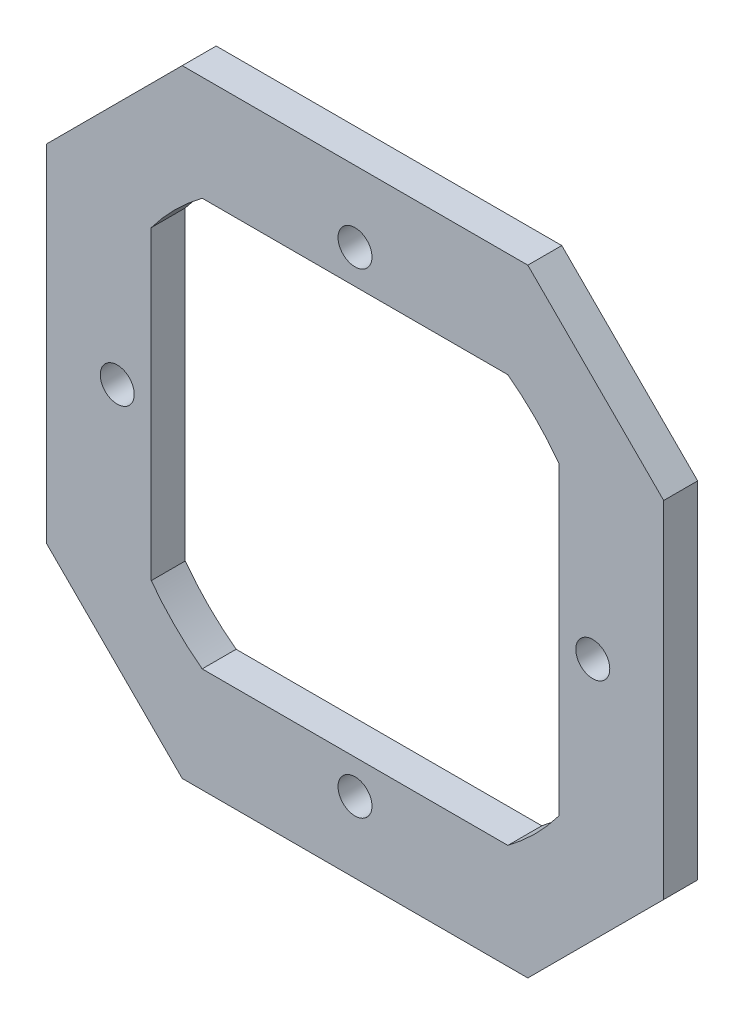
ISO-10303-21;
HEADER;
FILE_DESCRIPTION(('STEP AP214'),'2;1');
FILE_NAME('part.step','',(''),(''),'','','');
FILE_SCHEMA(('AUTOMOTIVE_DESIGN { 1 0 10303 214 1 1 1 1 }'));
ENDSEC;
DATA;
#1=APPLICATION_CONTEXT('core data for automotive mechanical design processes');
#2=APPLICATION_PROTOCOL_DEFINITION('international standard','automotive_design',2000,#1);
#3=PRODUCT_CONTEXT('',#1,'mechanical');
#4=PRODUCT('Part','Part','',(#3));
#5=PRODUCT_RELATED_PRODUCT_CATEGORY('part','',(#4));
#6=PRODUCT_DEFINITION_FORMATION('','',#4);
#7=PRODUCT_DEFINITION_CONTEXT('part definition',#1,'design');
#8=PRODUCT_DEFINITION('design','',#6,#7);
#9=PRODUCT_DEFINITION_SHAPE('','',#8);
#10=(LENGTH_UNIT() NAMED_UNIT(*) SI_UNIT(.MILLI.,.METRE.));
#11=(NAMED_UNIT(*) PLANE_ANGLE_UNIT() SI_UNIT($,.RADIAN.));
#12=(NAMED_UNIT(*) SI_UNIT($,.STERADIAN.) SOLID_ANGLE_UNIT());
#13=UNCERTAINTY_MEASURE_WITH_UNIT(LENGTH_MEASURE(1.E-05),#10,'distance_accuracy_value','');
#14=(GEOMETRIC_REPRESENTATION_CONTEXT(3) GLOBAL_UNCERTAINTY_ASSIGNED_CONTEXT((#13)) GLOBAL_UNIT_ASSIGNED_CONTEXT((#10,
#11,#12)) REPRESENTATION_CONTEXT('',''));
#15=CARTESIAN_POINT('',(0.,0.,0.));
#16=DIRECTION('',(0.,0.,1.));
#17=DIRECTION('',(1.,0.,0.));
#18=AXIS2_PLACEMENT_3D('',#15,#16,#17);
#19=CARTESIAN_POINT('',(0.,0.,2.));
#20=DIRECTION('',(0.,0.,-1.));
#21=DIRECTION('',(-1.,0.,0.));
#22=AXIS2_PLACEMENT_3D('',#19,#20,#21);
#23=PLANE('',#22);
#24=DIRECTION('',(-1.,0.,0.));
#25=VECTOR('',#24,1.);
#26=CARTESIAN_POINT('',(-10.175,18.175,2.));
#27=LINE('',#26,#25);
#28=CARTESIAN_POINT('',(10.175,18.175,2.));
#29=VERTEX_POINT('',#28);
#30=CARTESIAN_POINT('',(-10.175,18.175,2.));
#31=VERTEX_POINT('',#30);
#32=EDGE_CURVE('E215',#29,#31,#27,.T.);
#33=ORIENTED_EDGE('',*,*,#32,.T.);
#34=DIRECTION('',(-0.707106781186548,-0.707106781186548,0.));
#35=VECTOR('',#34,1.);
#36=CARTESIAN_POINT('',(-18.175,10.175,2.));
#37=LINE('',#36,#35);
#38=CARTESIAN_POINT('',(-18.175,10.175,2.));
#39=VERTEX_POINT('',#38);
#40=EDGE_CURVE('E218',#31,#39,#37,.T.);
#41=ORIENTED_EDGE('',*,*,#40,.T.);
#42=DIRECTION('',(0.,-1.,0.));
#43=VECTOR('',#42,1.);
#44=CARTESIAN_POINT('',(-18.175,10.175,2.));
#45=LINE('',#44,#43);
#46=CARTESIAN_POINT('',(-18.175,-10.175,2.));
#47=VERTEX_POINT('',#46);
#48=EDGE_CURVE('E221',#39,#47,#45,.T.);
#49=ORIENTED_EDGE('',*,*,#48,.T.);
#50=DIRECTION('',(0.707106781186548,-0.707106781186548,0.));
#51=VECTOR('',#50,1.);
#52=CARTESIAN_POINT('',(-18.175,-10.175,2.));
#53=LINE('',#52,#51);
#54=CARTESIAN_POINT('',(-10.175,-18.175,2.));
#55=VERTEX_POINT('',#54);
#56=EDGE_CURVE('E223',#47,#55,#53,.T.);
#57=ORIENTED_EDGE('',*,*,#56,.T.);
#58=DIRECTION('',(1.,0.,0.));
#59=VECTOR('',#58,1.);
#60=CARTESIAN_POINT('',(-10.175,-18.175,2.));
#61=LINE('',#60,#59);
#62=CARTESIAN_POINT('',(10.175,-18.175,2.));
#63=VERTEX_POINT('',#62);
#64=EDGE_CURVE('E225',#55,#63,#61,.T.);
#65=ORIENTED_EDGE('',*,*,#64,.T.);
#66=DIRECTION('',(0.707106781186548,0.707106781186548,0.));
#67=VECTOR('',#66,1.);
#68=CARTESIAN_POINT('',(10.175,-18.175,2.));
#69=LINE('',#68,#67);
#70=CARTESIAN_POINT('',(18.175,-10.175,2.));
#71=VERTEX_POINT('',#70);
#72=EDGE_CURVE('E227',#63,#71,#69,.T.);
#73=ORIENTED_EDGE('',*,*,#72,.T.);
#74=DIRECTION('',(0.,1.,0.));
#75=VECTOR('',#74,1.);
#76=CARTESIAN_POINT('',(18.175,10.175,2.));
#77=LINE('',#76,#75);
#78=CARTESIAN_POINT('',(18.175,10.175,2.));
#79=VERTEX_POINT('',#78);
#80=EDGE_CURVE('E229',#71,#79,#77,.T.);
#81=ORIENTED_EDGE('',*,*,#80,.T.);
#82=DIRECTION('',(-0.707106781186548,0.707106781186548,0.));
#83=VECTOR('',#82,1.);
#84=CARTESIAN_POINT('',(10.175,18.175,2.));
#85=LINE('',#84,#83);
#86=EDGE_CURVE('E231',#79,#29,#85,.T.);
#87=ORIENTED_EDGE('',*,*,#86,.T.);
#88=EDGE_LOOP('',(#33,#41,#49,#57,#65,#73,#81,#87));
#89=FACE_BOUND('',#88,.T.);
#90=CARTESIAN_POINT('',(0.,0.,2.));
#91=DIRECTION('',(0.,0.,1.));
#92=DIRECTION('',(1.,0.,0.));
#93=AXIS2_PLACEMENT_3D('',#90,#91,#92);
#94=CIRCLE('',#93,15.);
#95=CARTESIAN_POINT('',(-12.,-9.,2.));
#96=VERTEX_POINT('',#95);
#97=CARTESIAN_POINT('',(-9.,-12.,2.));
#98=VERTEX_POINT('',#97);
#99=EDGE_CURVE('E147',#96,#98,#94,.T.);
#100=ORIENTED_EDGE('',*,*,#99,.F.);
#101=DIRECTION('',(0.,-1.,0.));
#102=VECTOR('',#101,1.);
#103=CARTESIAN_POINT('',(-12.,9.,2.));
#104=LINE('',#103,#102);
#105=CARTESIAN_POINT('',(-12.,9.,2.));
#106=VERTEX_POINT('',#105);
#107=EDGE_CURVE('E182',#106,#96,#104,.T.);
#108=ORIENTED_EDGE('',*,*,#107,.F.);
#109=CARTESIAN_POINT('',(0.,0.,2.));
#110=DIRECTION('',(0.,0.,1.));
#111=DIRECTION('',(1.,0.,0.));
#112=AXIS2_PLACEMENT_3D('',#109,#110,#111);
#113=CIRCLE('',#112,15.);
#114=CARTESIAN_POINT('',(-9.,12.,2.));
#115=VERTEX_POINT('',#114);
#116=EDGE_CURVE('E180',#115,#106,#113,.T.);
#117=ORIENTED_EDGE('',*,*,#116,.F.);
#118=DIRECTION('',(-1.,0.,0.));
#119=VECTOR('',#118,1.);
#120=CARTESIAN_POINT('',(-9.,12.,2.));
#121=LINE('',#120,#119);
#122=CARTESIAN_POINT('',(9.,12.,2.));
#123=VERTEX_POINT('',#122);
#124=EDGE_CURVE('E178',#123,#115,#121,.T.);
#125=ORIENTED_EDGE('',*,*,#124,.F.);
#126=CARTESIAN_POINT('',(0.,0.,2.));
#127=DIRECTION('',(0.,0.,1.));
#128=DIRECTION('',(1.,0.,0.));
#129=AXIS2_PLACEMENT_3D('',#126,#127,#128);
#130=CIRCLE('',#129,15.);
#131=CARTESIAN_POINT('',(12.,9.,2.));
#132=VERTEX_POINT('',#131);
#133=EDGE_CURVE('E176',#132,#123,#130,.T.);
#134=ORIENTED_EDGE('',*,*,#133,.F.);
#135=DIRECTION('',(0.,1.,0.));
#136=VECTOR('',#135,1.);
#137=CARTESIAN_POINT('',(12.,9.,2.));
#138=LINE('',#137,#136);
#139=CARTESIAN_POINT('',(12.,-9.,2.));
#140=VERTEX_POINT('',#139);
#141=EDGE_CURVE('E171',#140,#132,#138,.T.);
#142=ORIENTED_EDGE('',*,*,#141,.F.);
#143=CARTESIAN_POINT('',(0.,0.,2.));
#144=DIRECTION('',(0.,0.,1.));
#145=DIRECTION('',(1.,0.,0.));
#146=AXIS2_PLACEMENT_3D('',#143,#144,#145);
#147=CIRCLE('',#146,15.);
#148=CARTESIAN_POINT('',(9.,-12.,2.));
#149=VERTEX_POINT('',#148);
#150=EDGE_CURVE('E169',#149,#140,#147,.T.);
#151=ORIENTED_EDGE('',*,*,#150,.F.);
#152=DIRECTION('',(1.,0.,0.));
#153=VECTOR('',#152,1.);
#154=CARTESIAN_POINT('',(-9.,-12.,2.));
#155=LINE('',#154,#153);
#156=EDGE_CURVE('E155',#98,#149,#155,.T.);
#157=ORIENTED_EDGE('',*,*,#156,.F.);
#158=EDGE_LOOP('',(#100,#108,#117,#125,#134,#142,#151,#157));
#159=FACE_BOUND('',#158,.T.);
#160=CARTESIAN_POINT('',(14.,0.,2.));
#161=DIRECTION('',(0.,0.,1.));
#162=DIRECTION('',(1.,0.,0.));
#163=AXIS2_PLACEMENT_3D('',#160,#161,#162);
#164=CIRCLE('',#163,1.);
#165=CARTESIAN_POINT('',(15.,0.,2.));
#166=VERTEX_POINT('',#165);
#167=EDGE_CURVE('E185',#166,#166,#164,.T.);
#168=ORIENTED_EDGE('',*,*,#167,.F.);
#169=EDGE_LOOP('',(#168));
#170=FACE_BOUND('',#169,.T.);
#171=CARTESIAN_POINT('',(-14.,0.,2.));
#172=DIRECTION('',(0.,0.,1.));
#173=DIRECTION('',(1.,0.,0.));
#174=AXIS2_PLACEMENT_3D('',#171,#172,#173);
#175=CIRCLE('',#174,1.);
#176=CARTESIAN_POINT('',(-13.,0.,2.));
#177=VERTEX_POINT('',#176);
#178=EDGE_CURVE('E393',#177,#177,#175,.T.);
#179=ORIENTED_EDGE('',*,*,#178,.F.);
#180=EDGE_LOOP('',(#179));
#181=FACE_BOUND('',#180,.T.);
#182=CARTESIAN_POINT('',(0.,-14.,2.));
#183=DIRECTION('',(0.,0.,1.));
#184=DIRECTION('',(1.,0.,0.));
#185=AXIS2_PLACEMENT_3D('',#182,#183,#184);
#186=CIRCLE('',#185,1.);
#187=CARTESIAN_POINT('',(1.,-14.,2.));
#188=VERTEX_POINT('',#187);
#189=EDGE_CURVE('E387',#188,#188,#186,.T.);
#190=ORIENTED_EDGE('',*,*,#189,.F.);
#191=EDGE_LOOP('',(#190));
#192=FACE_BOUND('',#191,.T.);
#193=CARTESIAN_POINT('',(0.,14.,2.));
#194=DIRECTION('',(0.,0.,1.));
#195=DIRECTION('',(1.,0.,0.));
#196=AXIS2_PLACEMENT_3D('',#193,#194,#195);
#197=CIRCLE('',#196,1.);
#198=CARTESIAN_POINT('',(1.,14.,2.));
#199=VERTEX_POINT('',#198);
#200=EDGE_CURVE('E378',#199,#199,#197,.T.);
#201=ORIENTED_EDGE('',*,*,#200,.F.);
#202=EDGE_LOOP('',(#201));
#203=FACE_BOUND('',#202,.T.);
#204=ADVANCED_FACE('F34',(#89,#159,#170,#181,#192,#203),#23,.F.);
#205=CARTESIAN_POINT('',(0.,0.,0.));
#206=DIRECTION('',(0.,0.,-1.));
#207=DIRECTION('',(-1.,0.,0.));
#208=AXIS2_PLACEMENT_3D('',#205,#206,#207);
#209=PLANE('',#208);
#210=CARTESIAN_POINT('',(0.,-14.,0.));
#211=DIRECTION('',(0.,0.,1.));
#212=DIRECTION('',(1.,0.,0.));
#213=AXIS2_PLACEMENT_3D('',#210,#211,#212);
#214=CIRCLE('',#213,1.);
#215=CARTESIAN_POINT('',(1.,-14.,0.));
#216=VERTEX_POINT('',#215);
#217=EDGE_CURVE('E384',#216,#216,#214,.T.);
#218=ORIENTED_EDGE('',*,*,#217,.T.);
#219=EDGE_LOOP('',(#218));
#220=FACE_BOUND('',#219,.T.);
#221=CARTESIAN_POINT('',(14.,0.,0.));
#222=DIRECTION('',(0.,0.,1.));
#223=DIRECTION('',(1.,0.,0.));
#224=AXIS2_PLACEMENT_3D('',#221,#222,#223);
#225=CIRCLE('',#224,1.);
#226=CARTESIAN_POINT('',(15.,0.,0.));
#227=VERTEX_POINT('',#226);
#228=EDGE_CURVE('E396',#227,#227,#225,.T.);
#229=ORIENTED_EDGE('',*,*,#228,.T.);
#230=EDGE_LOOP('',(#229));
#231=FACE_BOUND('',#230,.T.);
#232=DIRECTION('',(-1.,0.,0.));
#233=VECTOR('',#232,1.);
#234=CARTESIAN_POINT('',(-10.175,18.175,0.));
#235=LINE('',#234,#233);
#236=CARTESIAN_POINT('',(10.175,18.175,0.));
#237=VERTEX_POINT('',#236);
#238=CARTESIAN_POINT('',(-10.175,18.175,0.));
#239=VERTEX_POINT('',#238);
#240=EDGE_CURVE('E163',#237,#239,#235,.T.);
#241=ORIENTED_EDGE('',*,*,#240,.F.);
#242=DIRECTION('',(-0.707106781186548,0.707106781186548,0.));
#243=VECTOR('',#242,1.);
#244=CARTESIAN_POINT('',(10.175,18.175,0.));
#245=LINE('',#244,#243);
#246=CARTESIAN_POINT('',(18.175,10.175,0.));
#247=VERTEX_POINT('',#246);
#248=EDGE_CURVE('E219',#247,#237,#245,.T.);
#249=ORIENTED_EDGE('',*,*,#248,.F.);
#250=DIRECTION('',(0.,1.,0.));
#251=VECTOR('',#250,1.);
#252=CARTESIAN_POINT('',(18.175,10.175,0.));
#253=LINE('',#252,#251);
#254=CARTESIAN_POINT('',(18.175,-10.175,0.));
#255=VERTEX_POINT('',#254);
#256=EDGE_CURVE('E246',#255,#247,#253,.T.);
#257=ORIENTED_EDGE('',*,*,#256,.F.);
#258=DIRECTION('',(0.707106781186548,0.707106781186548,0.));
#259=VECTOR('',#258,1.);
#260=CARTESIAN_POINT('',(10.175,-18.175,0.));
#261=LINE('',#260,#259);
#262=CARTESIAN_POINT('',(10.175,-18.175,0.));
#263=VERTEX_POINT('',#262);
#264=EDGE_CURVE('E244',#263,#255,#261,.T.);
#265=ORIENTED_EDGE('',*,*,#264,.F.);
#266=DIRECTION('',(1.,0.,0.));
#267=VECTOR('',#266,1.);
#268=CARTESIAN_POINT('',(-10.175,-18.175,0.));
#269=LINE('',#268,#267);
#270=CARTESIAN_POINT('',(-10.175,-18.175,0.));
#271=VERTEX_POINT('',#270);
#272=EDGE_CURVE('E242',#271,#263,#269,.T.);
#273=ORIENTED_EDGE('',*,*,#272,.F.);
#274=DIRECTION('',(0.707106781186548,-0.707106781186548,0.));
#275=VECTOR('',#274,1.);
#276=CARTESIAN_POINT('',(-18.175,-10.175,0.));
#277=LINE('',#276,#275);
#278=CARTESIAN_POINT('',(-18.175,-10.175,0.));
#279=VERTEX_POINT('',#278);
#280=EDGE_CURVE('E240',#279,#271,#277,.T.);
#281=ORIENTED_EDGE('',*,*,#280,.F.);
#282=DIRECTION('',(0.,-1.,0.));
#283=VECTOR('',#282,1.);
#284=CARTESIAN_POINT('',(-18.175,10.175,0.));
#285=LINE('',#284,#283);
#286=CARTESIAN_POINT('',(-18.175,10.175,0.));
#287=VERTEX_POINT('',#286);
#288=EDGE_CURVE('E238',#287,#279,#285,.T.);
#289=ORIENTED_EDGE('',*,*,#288,.F.);
#290=DIRECTION('',(-0.707106781186548,-0.707106781186548,0.));
#291=VECTOR('',#290,1.);
#292=CARTESIAN_POINT('',(-18.175,10.175,0.));
#293=LINE('',#292,#291);
#294=EDGE_CURVE('E236',#239,#287,#293,.T.);
#295=ORIENTED_EDGE('',*,*,#294,.F.);
#296=EDGE_LOOP('',(#241,#249,#257,#265,#273,#281,#289,#295));
#297=FACE_BOUND('',#296,.T.);
#298=DIRECTION('',(0.,-1.,0.));
#299=VECTOR('',#298,1.);
#300=CARTESIAN_POINT('',(-12.,9.,0.));
#301=LINE('',#300,#299);
#302=CARTESIAN_POINT('',(-12.,9.,0.));
#303=VERTEX_POINT('',#302);
#304=CARTESIAN_POINT('',(-12.,-9.,0.));
#305=VERTEX_POINT('',#304);
#306=EDGE_CURVE('E156',#303,#305,#301,.T.);
#307=ORIENTED_EDGE('',*,*,#306,.T.);
#308=CARTESIAN_POINT('',(0.,0.,0.));
#309=DIRECTION('',(0.,0.,1.));
#310=DIRECTION('',(1.,0.,0.));
#311=AXIS2_PLACEMENT_3D('',#308,#309,#310);
#312=CIRCLE('',#311,15.);
#313=CARTESIAN_POINT('',(-9.,-12.,0.));
#314=VERTEX_POINT('',#313);
#315=EDGE_CURVE('E57',#305,#314,#312,.T.);
#316=ORIENTED_EDGE('',*,*,#315,.T.);
#317=DIRECTION('',(1.,0.,0.));
#318=VECTOR('',#317,1.);
#319=CARTESIAN_POINT('',(-9.,-12.,0.));
#320=LINE('',#319,#318);
#321=CARTESIAN_POINT('',(9.,-12.,0.));
#322=VERTEX_POINT('',#321);
#323=EDGE_CURVE('E162',#314,#322,#320,.T.);
#324=ORIENTED_EDGE('',*,*,#323,.T.);
#325=CARTESIAN_POINT('',(0.,0.,0.));
#326=DIRECTION('',(0.,0.,1.));
#327=DIRECTION('',(1.,0.,0.));
#328=AXIS2_PLACEMENT_3D('',#325,#326,#327);
#329=CIRCLE('',#328,15.);
#330=CARTESIAN_POINT('',(12.,-9.,0.));
#331=VERTEX_POINT('',#330);
#332=EDGE_CURVE('E187',#322,#331,#329,.T.);
#333=ORIENTED_EDGE('',*,*,#332,.T.);
#334=DIRECTION('',(0.,1.,0.));
#335=VECTOR('',#334,1.);
#336=CARTESIAN_POINT('',(12.,9.,0.));
#337=LINE('',#336,#335);
#338=CARTESIAN_POINT('',(12.,9.,0.));
#339=VERTEX_POINT('',#338);
#340=EDGE_CURVE('E190',#331,#339,#337,.T.);
#341=ORIENTED_EDGE('',*,*,#340,.T.);
#342=CARTESIAN_POINT('',(0.,0.,0.));
#343=DIRECTION('',(0.,0.,1.));
#344=DIRECTION('',(1.,0.,0.));
#345=AXIS2_PLACEMENT_3D('',#342,#343,#344);
#346=CIRCLE('',#345,15.);
#347=CARTESIAN_POINT('',(9.,12.,0.));
#348=VERTEX_POINT('',#347);
#349=EDGE_CURVE('E193',#339,#348,#346,.T.);
#350=ORIENTED_EDGE('',*,*,#349,.T.);
#351=DIRECTION('',(-1.,0.,0.));
#352=VECTOR('',#351,1.);
#353=CARTESIAN_POINT('',(-9.,12.,0.));
#354=LINE('',#353,#352);
#355=CARTESIAN_POINT('',(-9.,12.,0.));
#356=VERTEX_POINT('',#355);
#357=EDGE_CURVE('E196',#348,#356,#354,.T.);
#358=ORIENTED_EDGE('',*,*,#357,.T.);
#359=CARTESIAN_POINT('',(0.,0.,0.));
#360=DIRECTION('',(0.,0.,1.));
#361=DIRECTION('',(1.,0.,0.));
#362=AXIS2_PLACEMENT_3D('',#359,#360,#361);
#363=CIRCLE('',#362,15.);
#364=EDGE_CURVE('E199',#356,#303,#363,.T.);
#365=ORIENTED_EDGE('',*,*,#364,.T.);
#366=EDGE_LOOP('',(#307,#316,#324,#333,#341,#350,#358,#365));
#367=FACE_BOUND('',#366,.T.);
#368=CARTESIAN_POINT('',(-14.,0.,0.));
#369=DIRECTION('',(0.,0.,1.));
#370=DIRECTION('',(1.,0.,0.));
#371=AXIS2_PLACEMENT_3D('',#368,#369,#370);
#372=CIRCLE('',#371,1.);
#373=CARTESIAN_POINT('',(-13.,0.,0.));
#374=VERTEX_POINT('',#373);
#375=EDGE_CURVE('E390',#374,#374,#372,.T.);
#376=ORIENTED_EDGE('',*,*,#375,.T.);
#377=EDGE_LOOP('',(#376));
#378=FACE_BOUND('',#377,.T.);
#379=CARTESIAN_POINT('',(0.,14.,0.));
#380=DIRECTION('',(0.,0.,1.));
#381=DIRECTION('',(1.,0.,0.));
#382=AXIS2_PLACEMENT_3D('',#379,#380,#381);
#383=CIRCLE('',#382,1.);
#384=CARTESIAN_POINT('',(1.,14.,0.));
#385=VERTEX_POINT('',#384);
#386=EDGE_CURVE('E381',#385,#385,#383,.T.);
#387=ORIENTED_EDGE('',*,*,#386,.T.);
#388=EDGE_LOOP('',(#387));
#389=FACE_BOUND('',#388,.T.);
#390=ADVANCED_FACE('F276',(#220,#231,#297,#367,#378,#389),#209,.T.);
#391=CARTESIAN_POINT('',(-10.175,18.175,2.));
#392=DIRECTION('',(0.,-1.,0.));
#393=DIRECTION('',(0.,0.,-1.));
#394=AXIS2_PLACEMENT_3D('',#391,#392,#393);
#395=PLANE('',#394);
#396=ORIENTED_EDGE('',*,*,#240,.T.);
#397=DIRECTION('',(0.,0.,-1.));
#398=VECTOR('',#397,1.);
#399=CARTESIAN_POINT('',(-10.175,18.175,2.));
#400=LINE('',#399,#398);
#401=EDGE_CURVE('E11',#31,#239,#400,.T.);
#402=ORIENTED_EDGE('',*,*,#401,.F.);
#403=ORIENTED_EDGE('',*,*,#32,.F.);
#404=DIRECTION('',(0.,0.,-1.));
#405=VECTOR('',#404,1.);
#406=CARTESIAN_POINT('',(10.175,18.175,2.));
#407=LINE('',#406,#405);
#408=EDGE_CURVE('E233',#29,#237,#407,.T.);
#409=ORIENTED_EDGE('',*,*,#408,.T.);
#410=EDGE_LOOP('',(#396,#402,#403,#409));
#411=FACE_BOUND('',#410,.T.);
#412=ADVANCED_FACE('F36',(#411),#395,.F.);
#413=CARTESIAN_POINT('',(-18.175,10.175,2.));
#414=DIRECTION('',(0.707106781186547,-0.707106781186547,0.));
#415=DIRECTION('',(0.707106781186548,0.707106781186548,0.));
#416=AXIS2_PLACEMENT_3D('',#413,#414,#415);
#417=PLANE('',#416);
#418=ORIENTED_EDGE('',*,*,#294,.T.);
#419=DIRECTION('',(0.,0.,-1.));
#420=VECTOR('',#419,1.);
#421=CARTESIAN_POINT('',(-18.175,10.175,2.));
#422=LINE('',#421,#420);
#423=EDGE_CURVE('E42',#39,#287,#422,.T.);
#424=ORIENTED_EDGE('',*,*,#423,.F.);
#425=ORIENTED_EDGE('',*,*,#40,.F.);
#426=ORIENTED_EDGE('',*,*,#401,.T.);
#427=EDGE_LOOP('',(#418,#424,#425,#426));
#428=FACE_BOUND('',#427,.T.);
#429=ADVANCED_FACE('F293',(#428),#417,.F.);
#430=CARTESIAN_POINT('',(-18.175,10.175,2.));
#431=DIRECTION('',(1.,0.,0.));
#432=DIRECTION('',(0.,0.,-1.));
#433=AXIS2_PLACEMENT_3D('',#430,#431,#432);
#434=PLANE('',#433);
#435=ORIENTED_EDGE('',*,*,#288,.T.);
#436=DIRECTION('',(0.,0.,-1.));
#437=VECTOR('',#436,1.);
#438=CARTESIAN_POINT('',(-18.175,-10.175,2.));
#439=LINE('',#438,#437);
#440=EDGE_CURVE('E263',#47,#279,#439,.T.);
#441=ORIENTED_EDGE('',*,*,#440,.F.);
#442=ORIENTED_EDGE('',*,*,#48,.F.);
#443=ORIENTED_EDGE('',*,*,#423,.T.);
#444=EDGE_LOOP('',(#435,#441,#442,#443));
#445=FACE_BOUND('',#444,.T.);
#446=ADVANCED_FACE('F270',(#445),#434,.F.);
#447=CARTESIAN_POINT('',(-18.175,-10.175,2.));
#448=DIRECTION('',(0.707106781186547,0.707106781186547,0.));
#449=DIRECTION('',(-0.707106781186548,0.707106781186548,0.));
#450=AXIS2_PLACEMENT_3D('',#447,#448,#449);
#451=PLANE('',#450);
#452=ORIENTED_EDGE('',*,*,#280,.T.);
#453=DIRECTION('',(0.,0.,-1.));
#454=VECTOR('',#453,1.);
#455=CARTESIAN_POINT('',(-10.175,-18.175,2.));
#456=LINE('',#455,#454);
#457=EDGE_CURVE('E260',#55,#271,#456,.T.);
#458=ORIENTED_EDGE('',*,*,#457,.F.);
#459=ORIENTED_EDGE('',*,*,#56,.F.);
#460=ORIENTED_EDGE('',*,*,#440,.T.);
#461=EDGE_LOOP('',(#452,#458,#459,#460));
#462=FACE_BOUND('',#461,.T.);
#463=ADVANCED_FACE('F282',(#462),#451,.F.);
#464=CARTESIAN_POINT('',(-10.175,-18.175,2.));
#465=DIRECTION('',(0.,1.,0.));
#466=DIRECTION('',(0.,0.,1.));
#467=AXIS2_PLACEMENT_3D('',#464,#465,#466);
#468=PLANE('',#467);
#469=ORIENTED_EDGE('',*,*,#272,.T.);
#470=DIRECTION('',(0.,0.,-1.));
#471=VECTOR('',#470,1.);
#472=CARTESIAN_POINT('',(10.175,-18.175,2.));
#473=LINE('',#472,#471);
#474=EDGE_CURVE('E257',#63,#263,#473,.T.);
#475=ORIENTED_EDGE('',*,*,#474,.F.);
#476=ORIENTED_EDGE('',*,*,#64,.F.);
#477=ORIENTED_EDGE('',*,*,#457,.T.);
#478=EDGE_LOOP('',(#469,#475,#476,#477));
#479=FACE_BOUND('',#478,.T.);
#480=ADVANCED_FACE('F286',(#479),#468,.F.);
#481=CARTESIAN_POINT('',(10.175,-18.175,2.));
#482=DIRECTION('',(-0.707106781186547,0.707106781186547,0.));
#483=DIRECTION('',(-0.707106781186548,-0.707106781186548,0.));
#484=AXIS2_PLACEMENT_3D('',#481,#482,#483);
#485=PLANE('',#484);
#486=ORIENTED_EDGE('',*,*,#264,.T.);
#487=DIRECTION('',(0.,0.,-1.));
#488=VECTOR('',#487,1.);
#489=CARTESIAN_POINT('',(18.175,-10.175,2.));
#490=LINE('',#489,#488);
#491=EDGE_CURVE('E254',#71,#255,#490,.T.);
#492=ORIENTED_EDGE('',*,*,#491,.F.);
#493=ORIENTED_EDGE('',*,*,#72,.F.);
#494=ORIENTED_EDGE('',*,*,#474,.T.);
#495=EDGE_LOOP('',(#486,#492,#493,#494));
#496=FACE_BOUND('',#495,.T.);
#497=ADVANCED_FACE('F306',(#496),#485,.F.);
#498=CARTESIAN_POINT('',(18.175,10.175,2.));
#499=DIRECTION('',(-1.,0.,0.));
#500=DIRECTION('',(0.,0.,1.));
#501=AXIS2_PLACEMENT_3D('',#498,#499,#500);
#502=PLANE('',#501);
#503=ORIENTED_EDGE('',*,*,#256,.T.);
#504=DIRECTION('',(0.,0.,-1.));
#505=VECTOR('',#504,1.);
#506=CARTESIAN_POINT('',(18.175,10.175,2.));
#507=LINE('',#506,#505);
#508=EDGE_CURVE('E251',#79,#247,#507,.T.);
#509=ORIENTED_EDGE('',*,*,#508,.F.);
#510=ORIENTED_EDGE('',*,*,#80,.F.);
#511=ORIENTED_EDGE('',*,*,#491,.T.);
#512=EDGE_LOOP('',(#503,#509,#510,#511));
#513=FACE_BOUND('',#512,.T.);
#514=ADVANCED_FACE('F304',(#513),#502,.F.);
#515=CARTESIAN_POINT('',(10.175,18.175,2.));
#516=DIRECTION('',(-0.707106781186547,-0.707106781186547,0.));
#517=DIRECTION('',(0.707106781186548,-0.707106781186548,0.));
#518=AXIS2_PLACEMENT_3D('',#515,#516,#517);
#519=PLANE('',#518);
#520=ORIENTED_EDGE('',*,*,#248,.T.);
#521=ORIENTED_EDGE('',*,*,#408,.F.);
#522=ORIENTED_EDGE('',*,*,#86,.F.);
#523=ORIENTED_EDGE('',*,*,#508,.T.);
#524=EDGE_LOOP('',(#520,#521,#522,#523));
#525=FACE_BOUND('',#524,.T.);
#526=ADVANCED_FACE('F299',(#525),#519,.F.);
#527=CARTESIAN_POINT('',(0.,0.,2.));
#528=DIRECTION('',(0.,0.,-1.));
#529=DIRECTION('',(-1.,0.,0.));
#530=AXIS2_PLACEMENT_3D('',#527,#528,#529);
#531=CYLINDRICAL_SURFACE('',#530,15.);
#532=ORIENTED_EDGE('',*,*,#315,.F.);
#533=DIRECTION('',(0.,0.,-1.));
#534=VECTOR('',#533,1.);
#535=CARTESIAN_POINT('',(-12.,-9.,2.));
#536=LINE('',#535,#534);
#537=EDGE_CURVE('E151',#96,#305,#536,.T.);
#538=ORIENTED_EDGE('',*,*,#537,.F.);
#539=ORIENTED_EDGE('',*,*,#99,.T.);
#540=DIRECTION('',(0.,0.,-1.));
#541=VECTOR('',#540,1.);
#542=CARTESIAN_POINT('',(-9.,-12.,2.));
#543=LINE('',#542,#541);
#544=EDGE_CURVE('E150',#98,#314,#543,.T.);
#545=ORIENTED_EDGE('',*,*,#544,.T.);
#546=EDGE_LOOP('',(#532,#538,#539,#545));
#547=FACE_BOUND('',#546,.T.);
#548=ADVANCED_FACE('F149',(#547),#531,.F.);
#549=CARTESIAN_POINT('',(-9.,-12.,2.));
#550=DIRECTION('',(0.,1.,0.));
#551=DIRECTION('',(0.,0.,1.));
#552=AXIS2_PLACEMENT_3D('',#549,#550,#551);
#553=PLANE('',#552);
#554=ORIENTED_EDGE('',*,*,#323,.F.);
#555=ORIENTED_EDGE('',*,*,#544,.F.);
#556=ORIENTED_EDGE('',*,*,#156,.T.);
#557=DIRECTION('',(0.,0.,-1.));
#558=VECTOR('',#557,1.);
#559=CARTESIAN_POINT('',(9.,-12.,2.));
#560=LINE('',#559,#558);
#561=EDGE_CURVE('E164',#149,#322,#560,.T.);
#562=ORIENTED_EDGE('',*,*,#561,.T.);
#563=EDGE_LOOP('',(#554,#555,#556,#562));
#564=FACE_BOUND('',#563,.T.);
#565=ADVANCED_FACE('F159',(#564),#553,.T.);
#566=CARTESIAN_POINT('',(0.,0.,2.));
#567=DIRECTION('',(0.,0.,-1.));
#568=DIRECTION('',(-1.,0.,0.));
#569=AXIS2_PLACEMENT_3D('',#566,#567,#568);
#570=CYLINDRICAL_SURFACE('',#569,15.);
#571=ORIENTED_EDGE('',*,*,#332,.F.);
#572=ORIENTED_EDGE('',*,*,#561,.F.);
#573=ORIENTED_EDGE('',*,*,#150,.T.);
#574=DIRECTION('',(0.,0.,-1.));
#575=VECTOR('',#574,1.);
#576=CARTESIAN_POINT('',(12.,-9.,2.));
#577=LINE('',#576,#575);
#578=EDGE_CURVE('E212',#140,#331,#577,.T.);
#579=ORIENTED_EDGE('',*,*,#578,.T.);
#580=EDGE_LOOP('',(#571,#572,#573,#579));
#581=FACE_BOUND('',#580,.T.);
#582=ADVANCED_FACE('F332',(#581),#570,.F.);
#583=CARTESIAN_POINT('',(12.,9.,2.));
#584=DIRECTION('',(-1.,0.,0.));
#585=DIRECTION('',(0.,0.,1.));
#586=AXIS2_PLACEMENT_3D('',#583,#584,#585);
#587=PLANE('',#586);
#588=ORIENTED_EDGE('',*,*,#340,.F.);
#589=ORIENTED_EDGE('',*,*,#578,.F.);
#590=ORIENTED_EDGE('',*,*,#141,.T.);
#591=DIRECTION('',(0.,0.,-1.));
#592=VECTOR('',#591,1.);
#593=CARTESIAN_POINT('',(12.,9.,2.));
#594=LINE('',#593,#592);
#595=EDGE_CURVE('E210',#132,#339,#594,.T.);
#596=ORIENTED_EDGE('',*,*,#595,.T.);
#597=EDGE_LOOP('',(#588,#589,#590,#596));
#598=FACE_BOUND('',#597,.T.);
#599=ADVANCED_FACE('F336',(#598),#587,.T.);
#600=CARTESIAN_POINT('',(0.,0.,2.));
#601=DIRECTION('',(0.,0.,-1.));
#602=DIRECTION('',(-1.,0.,0.));
#603=AXIS2_PLACEMENT_3D('',#600,#601,#602);
#604=CYLINDRICAL_SURFACE('',#603,15.);
#605=ORIENTED_EDGE('',*,*,#349,.F.);
#606=ORIENTED_EDGE('',*,*,#595,.F.);
#607=ORIENTED_EDGE('',*,*,#133,.T.);
#608=DIRECTION('',(0.,0.,-1.));
#609=VECTOR('',#608,1.);
#610=CARTESIAN_POINT('',(9.,12.,2.));
#611=LINE('',#610,#609);
#612=EDGE_CURVE('E208',#123,#348,#611,.T.);
#613=ORIENTED_EDGE('',*,*,#612,.T.);
#614=EDGE_LOOP('',(#605,#606,#607,#613));
#615=FACE_BOUND('',#614,.T.);
#616=ADVANCED_FACE('F342',(#615),#604,.F.);
#617=CARTESIAN_POINT('',(-9.,12.,2.));
#618=DIRECTION('',(0.,-1.,0.));
#619=DIRECTION('',(0.,0.,-1.));
#620=AXIS2_PLACEMENT_3D('',#617,#618,#619);
#621=PLANE('',#620);
#622=ORIENTED_EDGE('',*,*,#357,.F.);
#623=ORIENTED_EDGE('',*,*,#612,.F.);
#624=ORIENTED_EDGE('',*,*,#124,.T.);
#625=DIRECTION('',(0.,0.,-1.));
#626=VECTOR('',#625,1.);
#627=CARTESIAN_POINT('',(-9.,12.,2.));
#628=LINE('',#627,#626);
#629=EDGE_CURVE('E206',#115,#356,#628,.T.);
#630=ORIENTED_EDGE('',*,*,#629,.T.);
#631=EDGE_LOOP('',(#622,#623,#624,#630));
#632=FACE_BOUND('',#631,.T.);
#633=ADVANCED_FACE('F346',(#632),#621,.T.);
#634=CARTESIAN_POINT('',(0.,0.,2.));
#635=DIRECTION('',(0.,0.,-1.));
#636=DIRECTION('',(-1.,0.,0.));
#637=AXIS2_PLACEMENT_3D('',#634,#635,#636);
#638=CYLINDRICAL_SURFACE('',#637,15.);
#639=ORIENTED_EDGE('',*,*,#364,.F.);
#640=ORIENTED_EDGE('',*,*,#629,.F.);
#641=ORIENTED_EDGE('',*,*,#116,.T.);
#642=DIRECTION('',(0.,0.,-1.));
#643=VECTOR('',#642,1.);
#644=CARTESIAN_POINT('',(-12.,9.,2.));
#645=LINE('',#644,#643);
#646=EDGE_CURVE('E49',#106,#303,#645,.T.);
#647=ORIENTED_EDGE('',*,*,#646,.T.);
#648=EDGE_LOOP('',(#639,#640,#641,#647));
#649=FACE_BOUND('',#648,.T.);
#650=ADVANCED_FACE('F350',(#649),#638,.F.);
#651=CARTESIAN_POINT('',(-12.,9.,2.));
#652=DIRECTION('',(1.,0.,0.));
#653=DIRECTION('',(0.,0.,-1.));
#654=AXIS2_PLACEMENT_3D('',#651,#652,#653);
#655=PLANE('',#654);
#656=ORIENTED_EDGE('',*,*,#306,.F.);
#657=ORIENTED_EDGE('',*,*,#646,.F.);
#658=ORIENTED_EDGE('',*,*,#107,.T.);
#659=ORIENTED_EDGE('',*,*,#537,.T.);
#660=EDGE_LOOP('',(#656,#657,#658,#659));
#661=FACE_BOUND('',#660,.T.);
#662=ADVANCED_FACE('F354',(#661),#655,.T.);
#663=CARTESIAN_POINT('',(14.,0.,2.));
#664=DIRECTION('',(0.,0.,-1.));
#665=DIRECTION('',(-1.,0.,0.));
#666=AXIS2_PLACEMENT_3D('',#663,#664,#665);
#667=CYLINDRICAL_SURFACE('',#666,1.);
#668=ORIENTED_EDGE('',*,*,#167,.T.);
#669=EDGE_LOOP('',(#668));
#670=FACE_BOUND('',#669,.T.);
#671=ORIENTED_EDGE('',*,*,#228,.F.);
#672=EDGE_LOOP('',(#671));
#673=FACE_BOUND('',#672,.T.);
#674=ADVANCED_FACE('F358',(#670,#673),#667,.F.);
#675=CARTESIAN_POINT('',(-14.,0.,2.));
#676=DIRECTION('',(0.,0.,-1.));
#677=DIRECTION('',(-1.,0.,0.));
#678=AXIS2_PLACEMENT_3D('',#675,#676,#677);
#679=CYLINDRICAL_SURFACE('',#678,1.);
#680=ORIENTED_EDGE('',*,*,#178,.T.);
#681=EDGE_LOOP('',(#680));
#682=FACE_BOUND('',#681,.T.);
#683=ORIENTED_EDGE('',*,*,#375,.F.);
#684=EDGE_LOOP('',(#683));
#685=FACE_BOUND('',#684,.T.);
#686=ADVANCED_FACE('F361',(#682,#685),#679,.F.);
#687=CARTESIAN_POINT('',(0.,-14.,2.));
#688=DIRECTION('',(0.,0.,-1.));
#689=DIRECTION('',(-1.,0.,0.));
#690=AXIS2_PLACEMENT_3D('',#687,#688,#689);
#691=CYLINDRICAL_SURFACE('',#690,1.);
#692=ORIENTED_EDGE('',*,*,#189,.T.);
#693=EDGE_LOOP('',(#692));
#694=FACE_BOUND('',#693,.T.);
#695=ORIENTED_EDGE('',*,*,#217,.F.);
#696=EDGE_LOOP('',(#695));
#697=FACE_BOUND('',#696,.T.);
#698=ADVANCED_FACE('F365',(#694,#697),#691,.F.);
#699=CARTESIAN_POINT('',(0.,14.,2.));
#700=DIRECTION('',(0.,0.,-1.));
#701=DIRECTION('',(-1.,0.,0.));
#702=AXIS2_PLACEMENT_3D('',#699,#700,#701);
#703=CYLINDRICAL_SURFACE('',#702,1.);
#704=ORIENTED_EDGE('',*,*,#200,.T.);
#705=EDGE_LOOP('',(#704));
#706=FACE_BOUND('',#705,.T.);
#707=ORIENTED_EDGE('',*,*,#386,.F.);
#708=EDGE_LOOP('',(#707));
#709=FACE_BOUND('',#708,.T.);
#710=ADVANCED_FACE('F369',(#706,#709),#703,.F.);
#711=CLOSED_SHELL('',(#204,#390,#412,#429,#446,#463,#480,#497,#514,#526,#548,#565,#582,#599,
#616,#633,#650,#662,#674,#686,#698,#710));
#712=MANIFOLD_SOLID_BREP('B2',#711);
#713=ADVANCED_BREP_SHAPE_REPRESENTATION('',(#18,#712),#14);
#714=SHAPE_DEFINITION_REPRESENTATION(#9,#713);
ENDSEC;
END-ISO-10303-21;
